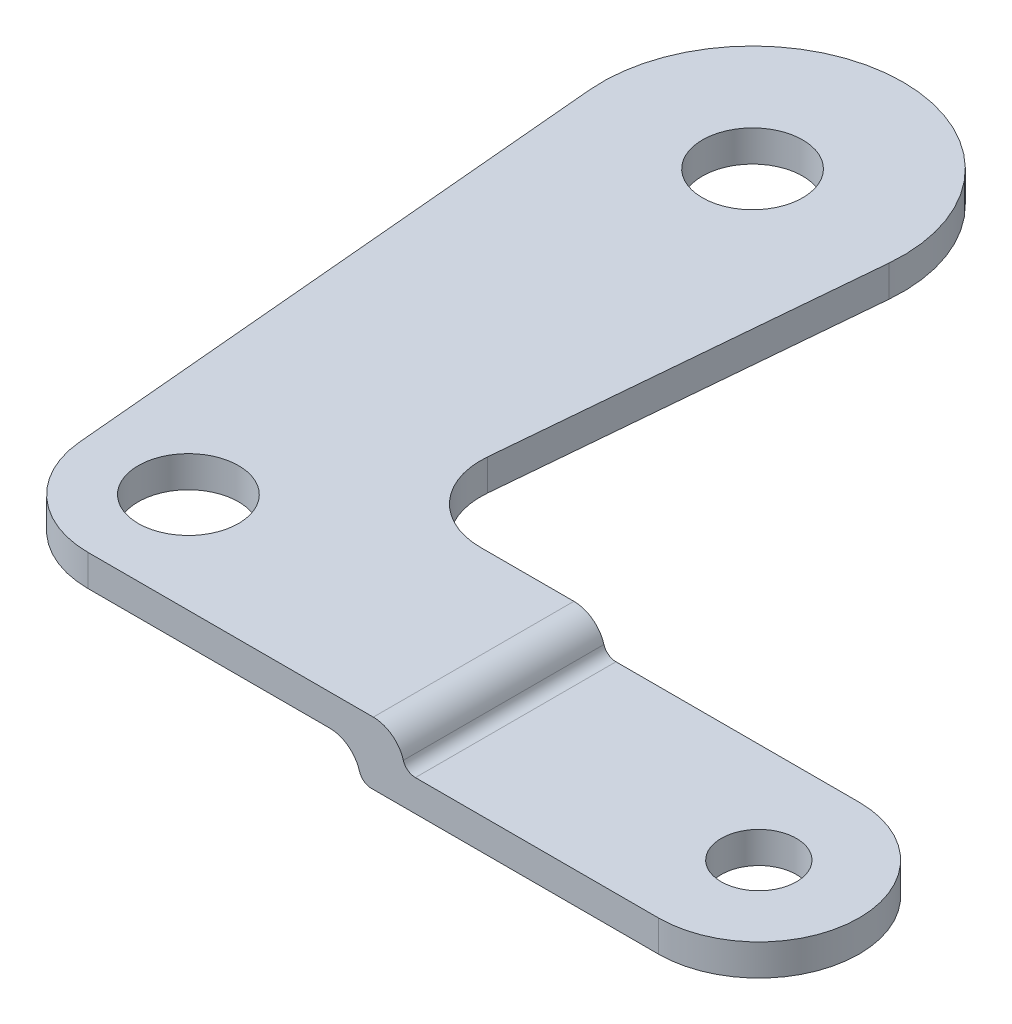
ISO-10303-21;
HEADER;
FILE_DESCRIPTION(('STEP AP214'),'2;1');
FILE_NAME('part.step','',(''),(''),'','','');
FILE_SCHEMA(('AUTOMOTIVE_DESIGN { 1 0 10303 214 1 1 1 1 }'));
ENDSEC;
DATA;
#1=APPLICATION_CONTEXT('core data for automotive mechanical design processes');
#2=APPLICATION_PROTOCOL_DEFINITION('international standard','automotive_design',2000,#1);
#3=PRODUCT_CONTEXT('',#1,'mechanical');
#4=PRODUCT('Part','Part','',(#3));
#5=PRODUCT_RELATED_PRODUCT_CATEGORY('part','',(#4));
#6=PRODUCT_DEFINITION_FORMATION('','',#4);
#7=PRODUCT_DEFINITION_CONTEXT('part definition',#1,'design');
#8=PRODUCT_DEFINITION('design','',#6,#7);
#9=PRODUCT_DEFINITION_SHAPE('','',#8);
#10=(LENGTH_UNIT() NAMED_UNIT(*) SI_UNIT(.MILLI.,.METRE.));
#11=(NAMED_UNIT(*) PLANE_ANGLE_UNIT() SI_UNIT($,.RADIAN.));
#12=(NAMED_UNIT(*) SI_UNIT($,.STERADIAN.) SOLID_ANGLE_UNIT());
#13=UNCERTAINTY_MEASURE_WITH_UNIT(LENGTH_MEASURE(1.E-05),#10,'distance_accuracy_value','');
#14=(GEOMETRIC_REPRESENTATION_CONTEXT(3) GLOBAL_UNCERTAINTY_ASSIGNED_CONTEXT((#13)) GLOBAL_UNIT_ASSIGNED_CONTEXT((#10,
#11,#12)) REPRESENTATION_CONTEXT('',''));
#15=CARTESIAN_POINT('',(0.,0.,0.));
#16=DIRECTION('',(0.,0.,1.));
#17=DIRECTION('',(1.,0.,0.));
#18=AXIS2_PLACEMENT_3D('',#15,#16,#17);
#19=CARTESIAN_POINT('',(0.,2.5,0.));
#20=DIRECTION('',(0.,1.,0.));
#21=DIRECTION('',(0.,0.,1.));
#22=AXIS2_PLACEMENT_3D('',#19,#20,#21);
#23=PLANE('',#22);
#24=CARTESIAN_POINT('',(45.5,2.5,0.));
#25=DIRECTION('',(0.,1.,0.));
#26=DIRECTION('',(0.,0.,1.));
#27=AXIS2_PLACEMENT_3D('',#24,#25,#26);
#28=CIRCLE('',#27,3.);
#29=CARTESIAN_POINT('',(45.5,2.5,2.99999999999999));
#30=VERTEX_POINT('',#29);
#31=EDGE_CURVE('E349',#30,#30,#28,.T.);
#32=ORIENTED_EDGE('',*,*,#31,.F.);
#33=EDGE_LOOP('',(#32));
#34=FACE_BOUND('',#33,.T.);
#35=DIRECTION('',(-1.,0.,0.));
#36=VECTOR('',#35,1.);
#37=CARTESIAN_POINT('',(0.,2.5,-8.));
#38=LINE('',#37,#36);
#39=CARTESIAN_POINT('',(45.5,2.5,-8.00000000000001));
#40=VERTEX_POINT('',#39);
#41=CARTESIAN_POINT('',(26.1041019662497,2.5,-8.00000000000001));
#42=VERTEX_POINT('',#41);
#43=EDGE_CURVE('E122',#40,#42,#38,.T.);
#44=ORIENTED_EDGE('',*,*,#43,.T.);
#45=DIRECTION('',(0.,0.,1.));
#46=VECTOR('',#45,1.);
#47=CARTESIAN_POINT('',(26.1041019662497,2.5,-7.99999999999998));
#48=LINE('',#47,#46);
#49=CARTESIAN_POINT('',(26.1041019662497,2.5,8.00000000000002));
#50=VERTEX_POINT('',#49);
#51=EDGE_CURVE('E117',#42,#50,#48,.T.);
#52=ORIENTED_EDGE('',*,*,#51,.T.);
#53=DIRECTION('',(-1.,0.,0.));
#54=VECTOR('',#53,1.);
#55=CARTESIAN_POINT('',(0.,2.5,8.00000000000002));
#56=LINE('',#55,#54);
#57=CARTESIAN_POINT('',(45.5,2.5,8.00000000000001));
#58=VERTEX_POINT('',#57);
#59=EDGE_CURVE('E346',#58,#50,#56,.T.);
#60=ORIENTED_EDGE('',*,*,#59,.F.);
#61=CARTESIAN_POINT('',(45.5,2.5,0.));
#62=DIRECTION('',(0.,1.,0.));
#63=DIRECTION('',(0.,0.,1.));
#64=AXIS2_PLACEMENT_3D('',#61,#62,#63);
#65=CIRCLE('',#64,8.00000000000001);
#66=EDGE_CURVE('E339',#40,#58,#65,.F.);
#67=ORIENTED_EDGE('',*,*,#66,.F.);
#68=EDGE_LOOP('',(#44,#52,#60,#67));
#69=FACE_BOUND('',#68,.T.);
#70=ADVANCED_FACE('F101',(#34,#69),#23,.T.);
#71=CARTESIAN_POINT('',(45.5,2.5,0.));
#72=DIRECTION('',(0.,-1.,0.));
#73=DIRECTION('',(0.,0.,-1.));
#74=AXIS2_PLACEMENT_3D('',#71,#72,#73);
#75=CYLINDRICAL_SURFACE('',#74,8.00000000000001);
#76=CARTESIAN_POINT('',(45.5,0.,0.));
#77=DIRECTION('',(0.,1.,0.));
#78=DIRECTION('',(0.,0.,1.));
#79=AXIS2_PLACEMENT_3D('',#76,#77,#78);
#80=CIRCLE('',#79,8.00000000000001);
#81=CARTESIAN_POINT('',(45.5,0.,-8.00000000000001));
#82=VERTEX_POINT('',#81);
#83=CARTESIAN_POINT('',(45.5,0.,8.00000000000001));
#84=VERTEX_POINT('',#83);
#85=EDGE_CURVE('E322',#82,#84,#80,.F.);
#86=ORIENTED_EDGE('',*,*,#85,.F.);
#87=DIRECTION('',(0.,-1.,0.));
#88=VECTOR('',#87,1.);
#89=CARTESIAN_POINT('',(45.5,2.5,-8.00000000000001));
#90=LINE('',#89,#88);
#91=EDGE_CURVE('E12',#40,#82,#90,.T.);
#92=ORIENTED_EDGE('',*,*,#91,.F.);
#93=ORIENTED_EDGE('',*,*,#66,.T.);
#94=DIRECTION('',(0.,-1.,0.));
#95=VECTOR('',#94,1.);
#96=CARTESIAN_POINT('',(45.5,2.5,8.00000000000001));
#97=LINE('',#96,#95);
#98=EDGE_CURVE('E110',#58,#84,#97,.T.);
#99=ORIENTED_EDGE('',*,*,#98,.T.);
#100=EDGE_LOOP('',(#86,#92,#93,#99));
#101=FACE_BOUND('',#100,.T.);
#102=ADVANCED_FACE('F103',(#101),#75,.T.);
#103=CARTESIAN_POINT('',(0.,2.5,-8.));
#104=DIRECTION('',(0.,0.,1.));
#105=DIRECTION('',(1.,0.,0.));
#106=AXIS2_PLACEMENT_3D('',#103,#104,#105);
#107=PLANE('',#106);
#108=CARTESIAN_POINT('',(19.25,0.,-7.99999999999998));
#109=DIRECTION('',(0.,0.,1.));
#110=DIRECTION('',(1.,0.,0.));
#111=AXIS2_PLACEMENT_3D('',#108,#109,#110);
#112=CIRCLE('',#111,2.5);
#113=CARTESIAN_POINT('',(19.25,2.5,-8.00000000000001));
#114=VERTEX_POINT('',#113);
#115=CARTESIAN_POINT('',(21.6457871187498,0.714285714285715,-7.99999999999998));
#116=VERTEX_POINT('',#115);
#117=EDGE_CURVE('E214',#114,#116,#112,.F.);
#118=ORIENTED_EDGE('',*,*,#117,.F.);
#119=DIRECTION('',(1.,0.,0.));
#120=VECTOR('',#119,1.);
#121=CARTESIAN_POINT('',(0.,2.5,-8.));
#122=LINE('',#121,#120);
#123=CARTESIAN_POINT('',(15.3050286650834,2.5,-8.));
#124=VERTEX_POINT('',#123);
#125=EDGE_CURVE('E221',#124,#114,#122,.T.);
#126=ORIENTED_EDGE('',*,*,#125,.F.);
#127=DIRECTION('',(0.,-1.,0.));
#128=VECTOR('',#127,1.);
#129=CARTESIAN_POINT('',(15.3050286650834,5.,-8.));
#130=LINE('',#129,#128);
#131=CARTESIAN_POINT('',(15.3050286650834,5.,-8.));
#132=VERTEX_POINT('',#131);
#133=EDGE_CURVE('E218',#132,#124,#130,.T.);
#134=ORIENTED_EDGE('',*,*,#133,.F.);
#135=DIRECTION('',(-1.,0.,0.));
#136=VECTOR('',#135,1.);
#137=CARTESIAN_POINT('',(0.,5.,-7.99999999999998));
#138=LINE('',#137,#136);
#139=CARTESIAN_POINT('',(22.75,5.,-7.99999999999998));
#140=VERTEX_POINT('',#139);
#141=EDGE_CURVE('E203',#140,#132,#138,.T.);
#142=ORIENTED_EDGE('',*,*,#141,.F.);
#143=CARTESIAN_POINT('',(22.75,2.5,-7.99999999999998));
#144=DIRECTION('',(0.,0.,1.));
#145=DIRECTION('',(1.,0.,0.));
#146=AXIS2_PLACEMENT_3D('',#143,#144,#145);
#147=CIRCLE('',#146,2.5);
#148=CARTESIAN_POINT('',(25.1457871187498,3.21428571428572,-7.99999999999998));
#149=VERTEX_POINT('',#148);
#150=EDGE_CURVE('E215',#140,#149,#147,.F.);
#151=ORIENTED_EDGE('',*,*,#150,.T.);
#152=CARTESIAN_POINT('',(26.1041019662497,3.5,-7.99999999999998));
#153=DIRECTION('',(0.,0.,1.));
#154=DIRECTION('',(1.,0.,0.));
#155=AXIS2_PLACEMENT_3D('',#152,#153,#154);
#156=CIRCLE('',#155,1.);
#157=EDGE_CURVE('E290',#149,#42,#156,.T.);
#158=ORIENTED_EDGE('',*,*,#157,.T.);
#159=ORIENTED_EDGE('',*,*,#43,.F.);
#160=ORIENTED_EDGE('',*,*,#91,.T.);
#161=DIRECTION('',(-1.,0.,0.));
#162=VECTOR('',#161,1.);
#163=CARTESIAN_POINT('',(0.,0.,-8.));
#164=LINE('',#163,#162);
#165=CARTESIAN_POINT('',(22.6041019662497,0.,-7.99999999999998));
#166=VERTEX_POINT('',#165);
#167=EDGE_CURVE('E356',#82,#166,#164,.T.);
#168=ORIENTED_EDGE('',*,*,#167,.T.);
#169=CARTESIAN_POINT('',(22.6041019662497,1.,-7.99999999999998));
#170=DIRECTION('',(0.,0.,1.));
#171=DIRECTION('',(1.,0.,0.));
#172=AXIS2_PLACEMENT_3D('',#169,#170,#171);
#173=CIRCLE('',#172,1.);
#174=EDGE_CURVE('E299',#116,#166,#173,.T.);
#175=ORIENTED_EDGE('',*,*,#174,.F.);
#176=EDGE_LOOP('',(#118,#126,#134,#142,#151,#158,#159,#160,#168,#175));
#177=FACE_BOUND('',#176,.T.);
#178=ADVANCED_FACE('F220',(#177),#107,.F.);
#179=CARTESIAN_POINT('',(0.,2.5,8.00000000000002));
#180=DIRECTION('',(0.,0.,1.));
#181=DIRECTION('',(1.,0.,0.));
#182=AXIS2_PLACEMENT_3D('',#179,#180,#181);
#183=PLANE('',#182);
#184=DIRECTION('',(1.,0.,0.));
#185=VECTOR('',#184,1.);
#186=CARTESIAN_POINT('',(0.,2.5,8.00000000000002));
#187=LINE('',#186,#185);
#188=CARTESIAN_POINT('',(0.,2.5,8.00000000000001));
#189=VERTEX_POINT('',#188);
#190=CARTESIAN_POINT('',(19.25,2.5,8.00000000000002));
#191=VERTEX_POINT('',#190);
#192=EDGE_CURVE('E233',#189,#191,#187,.T.);
#193=ORIENTED_EDGE('',*,*,#192,.T.);
#194=CARTESIAN_POINT('',(19.25,0.,8.00000000000002));
#195=DIRECTION('',(0.,0.,1.));
#196=DIRECTION('',(1.,0.,0.));
#197=AXIS2_PLACEMENT_3D('',#194,#195,#196);
#198=CIRCLE('',#197,2.5);
#199=CARTESIAN_POINT('',(21.6457871187498,0.714285714285715,8.00000000000002));
#200=VERTEX_POINT('',#199);
#201=EDGE_CURVE('E313',#191,#200,#198,.F.);
#202=ORIENTED_EDGE('',*,*,#201,.T.);
#203=CARTESIAN_POINT('',(22.6041019662497,1.,8.00000000000002));
#204=DIRECTION('',(0.,0.,1.));
#205=DIRECTION('',(1.,0.,0.));
#206=AXIS2_PLACEMENT_3D('',#203,#204,#205);
#207=CIRCLE('',#206,1.);
#208=CARTESIAN_POINT('',(22.6041019662497,0.,8.00000000000002));
#209=VERTEX_POINT('',#208);
#210=EDGE_CURVE('E293',#200,#209,#207,.T.);
#211=ORIENTED_EDGE('',*,*,#210,.T.);
#212=DIRECTION('',(-1.,0.,0.));
#213=VECTOR('',#212,1.);
#214=CARTESIAN_POINT('',(0.,0.,8.00000000000002));
#215=LINE('',#214,#213);
#216=EDGE_CURVE('E359',#84,#209,#215,.T.);
#217=ORIENTED_EDGE('',*,*,#216,.F.);
#218=ORIENTED_EDGE('',*,*,#98,.F.);
#219=ORIENTED_EDGE('',*,*,#59,.T.);
#220=CARTESIAN_POINT('',(26.1041019662497,3.5,8.00000000000002));
#221=DIRECTION('',(0.,0.,1.));
#222=DIRECTION('',(1.,0.,0.));
#223=AXIS2_PLACEMENT_3D('',#220,#221,#222);
#224=CIRCLE('',#223,1.);
#225=CARTESIAN_POINT('',(25.1457871187498,3.21428571428572,8.00000000000002));
#226=VERTEX_POINT('',#225);
#227=EDGE_CURVE('E226',#226,#50,#224,.T.);
#228=ORIENTED_EDGE('',*,*,#227,.F.);
#229=CARTESIAN_POINT('',(22.75,2.5,8.00000000000002));
#230=DIRECTION('',(0.,0.,1.));
#231=DIRECTION('',(1.,0.,0.));
#232=AXIS2_PLACEMENT_3D('',#229,#230,#231);
#233=CIRCLE('',#232,2.5);
#234=CARTESIAN_POINT('',(22.75,5.,8.00000000000002));
#235=VERTEX_POINT('',#234);
#236=EDGE_CURVE('E307',#235,#226,#233,.F.);
#237=ORIENTED_EDGE('',*,*,#236,.F.);
#238=DIRECTION('',(-1.,0.,0.));
#239=VECTOR('',#238,1.);
#240=CARTESIAN_POINT('',(0.,5.,8.00000000000002));
#241=LINE('',#240,#239);
#242=CARTESIAN_POINT('',(0.,5.,8.00000000000001));
#243=VERTEX_POINT('',#242);
#244=EDGE_CURVE('E310',#235,#243,#241,.T.);
#245=ORIENTED_EDGE('',*,*,#244,.T.);
#246=DIRECTION('',(0.,-1.,0.));
#247=VECTOR('',#246,1.);
#248=CARTESIAN_POINT('',(0.,5.,8.00000000000001));
#249=LINE('',#248,#247);
#250=EDGE_CURVE('E255',#243,#189,#249,.T.);
#251=ORIENTED_EDGE('',*,*,#250,.T.);
#252=EDGE_LOOP('',(#193,#202,#211,#217,#218,#219,#228,#237,#245,#251));
#253=FACE_BOUND('',#252,.T.);
#254=ADVANCED_FACE('F374',(#253),#183,.T.);
#255=CARTESIAN_POINT('',(45.5,2.5,0.));
#256=DIRECTION('',(0.,-1.,0.));
#257=DIRECTION('',(0.,0.,-1.));
#258=AXIS2_PLACEMENT_3D('',#255,#256,#257);
#259=CYLINDRICAL_SURFACE('',#258,3.);
#260=ORIENTED_EDGE('',*,*,#31,.T.);
#261=EDGE_LOOP('',(#260));
#262=FACE_BOUND('',#261,.T.);
#263=CARTESIAN_POINT('',(45.5,0.,0.));
#264=DIRECTION('',(0.,1.,0.));
#265=DIRECTION('',(0.,0.,1.));
#266=AXIS2_PLACEMENT_3D('',#263,#264,#265);
#267=CIRCLE('',#266,3.);
#268=CARTESIAN_POINT('',(45.5,0.,2.99999999999999));
#269=VERTEX_POINT('',#268);
#270=EDGE_CURVE('E343',#269,#269,#267,.T.);
#271=ORIENTED_EDGE('',*,*,#270,.F.);
#272=EDGE_LOOP('',(#271));
#273=FACE_BOUND('',#272,.T.);
#274=ADVANCED_FACE('F427',(#262,#273),#259,.F.);
#275=CARTESIAN_POINT('',(0.,0.,0.));
#276=DIRECTION('',(0.,1.,0.));
#277=DIRECTION('',(0.,0.,1.));
#278=AXIS2_PLACEMENT_3D('',#275,#276,#277);
#279=PLANE('',#278);
#280=ORIENTED_EDGE('',*,*,#85,.T.);
#281=ORIENTED_EDGE('',*,*,#216,.T.);
#282=DIRECTION('',(0.,0.,1.));
#283=VECTOR('',#282,1.);
#284=CARTESIAN_POINT('',(22.6041019662497,0.,-7.99999999999998));
#285=LINE('',#284,#283);
#286=EDGE_CURVE('E323',#166,#209,#285,.T.);
#287=ORIENTED_EDGE('',*,*,#286,.F.);
#288=ORIENTED_EDGE('',*,*,#167,.F.);
#289=EDGE_LOOP('',(#280,#281,#287,#288));
#290=FACE_BOUND('',#289,.T.);
#291=ORIENTED_EDGE('',*,*,#270,.T.);
#292=EDGE_LOOP('',(#291));
#293=FACE_BOUND('',#292,.T.);
#294=ADVANCED_FACE('F371',(#290,#293),#279,.F.);
#295=CARTESIAN_POINT('',(26.1041019662497,3.5,-7.99999999999998));
#296=DIRECTION('',(0.,0.,1.));
#297=DIRECTION('',(1.,0.,0.));
#298=AXIS2_PLACEMENT_3D('',#295,#296,#297);
#299=CYLINDRICAL_SURFACE('',#298,1.);
#300=ORIENTED_EDGE('',*,*,#227,.T.);
#301=ORIENTED_EDGE('',*,*,#51,.F.);
#302=ORIENTED_EDGE('',*,*,#157,.F.);
#303=DIRECTION('',(0.,0.,1.));
#304=VECTOR('',#303,1.);
#305=CARTESIAN_POINT('',(25.1457871187498,3.21428571428572,-7.99999999999998));
#306=LINE('',#305,#304);
#307=EDGE_CURVE('E303',#149,#226,#306,.T.);
#308=ORIENTED_EDGE('',*,*,#307,.T.);
#309=EDGE_LOOP('',(#300,#301,#302,#308));
#310=FACE_BOUND('',#309,.T.);
#311=ADVANCED_FACE('F412',(#310),#299,.F.);
#312=CARTESIAN_POINT('',(22.6041019662497,1.,-7.99999999999998));
#313=DIRECTION('',(0.,0.,1.));
#314=DIRECTION('',(1.,0.,0.));
#315=AXIS2_PLACEMENT_3D('',#312,#313,#314);
#316=CYLINDRICAL_SURFACE('',#315,1.);
#317=ORIENTED_EDGE('',*,*,#210,.F.);
#318=DIRECTION('',(0.,0.,1.));
#319=VECTOR('',#318,1.);
#320=CARTESIAN_POINT('',(21.6457871187498,0.714285714285715,-7.99999999999998));
#321=LINE('',#320,#319);
#322=EDGE_CURVE('E327',#116,#200,#321,.T.);
#323=ORIENTED_EDGE('',*,*,#322,.F.);
#324=ORIENTED_EDGE('',*,*,#174,.T.);
#325=ORIENTED_EDGE('',*,*,#286,.T.);
#326=EDGE_LOOP('',(#317,#323,#324,#325));
#327=FACE_BOUND('',#326,.T.);
#328=ADVANCED_FACE('F378',(#327),#316,.T.);
#329=CARTESIAN_POINT('',(19.25,0.,-7.99999999999998));
#330=DIRECTION('',(0.,0.,1.));
#331=DIRECTION('',(1.,0.,0.));
#332=AXIS2_PLACEMENT_3D('',#329,#330,#331);
#333=CYLINDRICAL_SURFACE('',#332,2.5);
#334=ORIENTED_EDGE('',*,*,#201,.F.);
#335=DIRECTION('',(0.,0.,1.));
#336=VECTOR('',#335,1.);
#337=CARTESIAN_POINT('',(19.25,2.5,-7.99999999999998));
#338=LINE('',#337,#336);
#339=EDGE_CURVE('E330',#114,#191,#338,.T.);
#340=ORIENTED_EDGE('',*,*,#339,.F.);
#341=ORIENTED_EDGE('',*,*,#117,.T.);
#342=ORIENTED_EDGE('',*,*,#322,.T.);
#343=EDGE_LOOP('',(#334,#340,#341,#342));
#344=FACE_BOUND('',#343,.T.);
#345=ADVANCED_FACE('F382',(#344),#333,.F.);
#346=CARTESIAN_POINT('',(0.,5.,-7.99999999999998));
#347=DIRECTION('',(0.,1.,0.));
#348=DIRECTION('',(0.,0.,1.));
#349=AXIS2_PLACEMENT_3D('',#346,#347,#348);
#350=PLANE('',#349);
#351=ORIENTED_EDGE('',*,*,#244,.F.);
#352=DIRECTION('',(0.,0.,1.));
#353=VECTOR('',#352,1.);
#354=CARTESIAN_POINT('',(22.75,5.,-7.99999999999998));
#355=LINE('',#354,#353);
#356=EDGE_CURVE('E210',#140,#235,#355,.T.);
#357=ORIENTED_EDGE('',*,*,#356,.F.);
#358=ORIENTED_EDGE('',*,*,#141,.T.);
#359=CARTESIAN_POINT('',(15.3050286650834,5.,-14.));
#360=DIRECTION('',(0.,1.,0.));
#361=DIRECTION('',(0.,0.,1.));
#362=AXIS2_PLACEMENT_3D('',#359,#360,#361);
#363=CIRCLE('',#362,6.);
#364=CARTESIAN_POINT('',(9.32877937681275,5.,-14.5333333333333));
#365=VERTEX_POINT('',#364);
#366=EDGE_CURVE('E209',#365,#132,#363,.T.);
#367=ORIENTED_EDGE('',*,*,#366,.F.);
#368=DIRECTION('',(0.0888888888888885,0.,-0.99604154804511));
#369=VECTOR('',#368,1.);
#370=CARTESIAN_POINT('',(7.9683323843609,5.,0.71111111111111));
#371=LINE('',#370,#369);
#372=CARTESIAN_POINT('',(11.9524985765413,5.,-43.9333333333334));
#373=VERTEX_POINT('',#372);
#374=EDGE_CURVE('E232',#365,#373,#371,.T.);
#375=ORIENTED_EDGE('',*,*,#374,.T.);
#376=CARTESIAN_POINT('',(0.,5.,-45.));
#377=DIRECTION('',(0.,1.,0.));
#378=DIRECTION('',(0.,0.,1.));
#379=AXIS2_PLACEMENT_3D('',#376,#377,#378);
#380=CIRCLE('',#379,12.);
#381=CARTESIAN_POINT('',(-11.9524985765413,5.,-43.9333333333334));
#382=VERTEX_POINT('',#381);
#383=EDGE_CURVE('E237',#373,#382,#380,.T.);
#384=ORIENTED_EDGE('',*,*,#383,.T.);
#385=DIRECTION('',(-0.0888888888888889,0.,-0.99604154804511));
#386=VECTOR('',#385,1.);
#387=CARTESIAN_POINT('',(-7.96833238436088,5.,0.711111111111111));
#388=LINE('',#387,#386);
#389=CARTESIAN_POINT('',(-7.96833238436088,5.,0.71111111111111));
#390=VERTEX_POINT('',#389);
#391=EDGE_CURVE('E247',#390,#382,#388,.T.);
#392=ORIENTED_EDGE('',*,*,#391,.F.);
#393=CARTESIAN_POINT('',(0.,5.,0.));
#394=DIRECTION('',(0.,1.,0.));
#395=DIRECTION('',(0.,0.,1.));
#396=AXIS2_PLACEMENT_3D('',#393,#394,#395);
#397=CIRCLE('',#396,8.00000000000001);
#398=EDGE_CURVE('E251',#390,#243,#397,.T.);
#399=ORIENTED_EDGE('',*,*,#398,.T.);
#400=EDGE_LOOP('',(#351,#357,#358,#367,#375,#384,#392,#399));
#401=FACE_BOUND('',#400,.T.);
#402=CARTESIAN_POINT('',(0.,5.,0.));
#403=DIRECTION('',(0.,1.,0.));
#404=DIRECTION('',(0.,0.,1.));
#405=AXIS2_PLACEMENT_3D('',#402,#403,#404);
#406=CIRCLE('',#405,4.);
#407=CARTESIAN_POINT('',(0.,5.,4.));
#408=VERTEX_POINT('',#407);
#409=EDGE_CURVE('E259',#408,#408,#406,.T.);
#410=ORIENTED_EDGE('',*,*,#409,.F.);
#411=EDGE_LOOP('',(#410));
#412=FACE_BOUND('',#411,.T.);
#413=CARTESIAN_POINT('',(0.,5.,-45.));
#414=DIRECTION('',(0.,1.,0.));
#415=DIRECTION('',(0.,0.,1.));
#416=AXIS2_PLACEMENT_3D('',#413,#414,#415);
#417=CIRCLE('',#416,4.);
#418=CARTESIAN_POINT('',(0.,5.,-41.));
#419=VERTEX_POINT('',#418);
#420=EDGE_CURVE('E592',#419,#419,#417,.T.);
#421=ORIENTED_EDGE('',*,*,#420,.F.);
#422=EDGE_LOOP('',(#421));
#423=FACE_BOUND('',#422,.T.);
#424=ADVANCED_FACE('F206',(#401,#412,#423),#350,.T.);
#425=CARTESIAN_POINT('',(22.75,2.5,-7.99999999999998));
#426=DIRECTION('',(0.,0.,1.));
#427=DIRECTION('',(1.,0.,0.));
#428=AXIS2_PLACEMENT_3D('',#425,#426,#427);
#429=CYLINDRICAL_SURFACE('',#428,2.5);
#430=ORIENTED_EDGE('',*,*,#236,.T.);
#431=ORIENTED_EDGE('',*,*,#307,.F.);
#432=ORIENTED_EDGE('',*,*,#150,.F.);
#433=ORIENTED_EDGE('',*,*,#356,.T.);
#434=EDGE_LOOP('',(#430,#431,#432,#433));
#435=FACE_BOUND('',#434,.T.);
#436=ADVANCED_FACE('F409',(#435),#429,.T.);
#437=CARTESIAN_POINT('',(15.3050286650834,2.5,-14.));
#438=DIRECTION('',(0.,1.,0.));
#439=DIRECTION('',(0.,0.,1.));
#440=AXIS2_PLACEMENT_3D('',#437,#438,#439);
#441=PLANE('',#440);
#442=ORIENTED_EDGE('',*,*,#339,.T.);
#443=ORIENTED_EDGE('',*,*,#192,.F.);
#444=CARTESIAN_POINT('',(0.,2.5,0.));
#445=DIRECTION('',(0.,1.,0.));
#446=DIRECTION('',(0.,0.,1.));
#447=AXIS2_PLACEMENT_3D('',#444,#445,#446);
#448=CIRCLE('',#447,8.00000000000001);
#449=CARTESIAN_POINT('',(-7.96833238436088,2.5,0.71111111111111));
#450=VERTEX_POINT('',#449);
#451=EDGE_CURVE('E239',#450,#189,#448,.T.);
#452=ORIENTED_EDGE('',*,*,#451,.F.);
#453=DIRECTION('',(-0.0888888888888889,0.,-0.99604154804511));
#454=VECTOR('',#453,1.);
#455=CARTESIAN_POINT('',(-7.96833238436088,2.5,0.711111111111111));
#456=LINE('',#455,#454);
#457=CARTESIAN_POINT('',(-11.9524985765413,2.5,-43.9333333333334));
#458=VERTEX_POINT('',#457);
#459=EDGE_CURVE('E269',#450,#458,#456,.T.);
#460=ORIENTED_EDGE('',*,*,#459,.T.);
#461=CARTESIAN_POINT('',(0.,2.5,-45.));
#462=DIRECTION('',(0.,1.,0.));
#463=DIRECTION('',(0.,0.,1.));
#464=AXIS2_PLACEMENT_3D('',#461,#462,#463);
#465=CIRCLE('',#464,12.);
#466=CARTESIAN_POINT('',(11.9524985765413,2.5,-43.9333333333334));
#467=VERTEX_POINT('',#466);
#468=EDGE_CURVE('E265',#467,#458,#465,.T.);
#469=ORIENTED_EDGE('',*,*,#468,.F.);
#470=DIRECTION('',(0.0888888888888885,0.,-0.99604154804511));
#471=VECTOR('',#470,1.);
#472=CARTESIAN_POINT('',(7.9683323843609,2.5,0.71111111111111));
#473=LINE('',#472,#471);
#474=CARTESIAN_POINT('',(9.32877937681275,2.5,-14.5333333333333));
#475=VERTEX_POINT('',#474);
#476=EDGE_CURVE('E262',#475,#467,#473,.T.);
#477=ORIENTED_EDGE('',*,*,#476,.F.);
#478=CARTESIAN_POINT('',(15.3050286650834,2.5,-14.));
#479=DIRECTION('',(0.,1.,0.));
#480=DIRECTION('',(0.,0.,1.));
#481=AXIS2_PLACEMENT_3D('',#478,#479,#480);
#482=CIRCLE('',#481,6.);
#483=EDGE_CURVE('E258',#475,#124,#482,.T.);
#484=ORIENTED_EDGE('',*,*,#483,.T.);
#485=ORIENTED_EDGE('',*,*,#125,.T.);
#486=EDGE_LOOP('',(#442,#443,#452,#460,#469,#477,#484,#485));
#487=FACE_BOUND('',#486,.T.);
#488=CARTESIAN_POINT('',(0.,2.5,0.));
#489=DIRECTION('',(0.,1.,0.));
#490=DIRECTION('',(0.,0.,1.));
#491=AXIS2_PLACEMENT_3D('',#488,#489,#490);
#492=CIRCLE('',#491,4.);
#493=CARTESIAN_POINT('',(0.,2.5,4.));
#494=VERTEX_POINT('',#493);
#495=EDGE_CURVE('E242',#494,#494,#492,.T.);
#496=ORIENTED_EDGE('',*,*,#495,.T.);
#497=EDGE_LOOP('',(#496));
#498=FACE_BOUND('',#497,.T.);
#499=CARTESIAN_POINT('',(0.,2.5,-45.));
#500=DIRECTION('',(0.,1.,0.));
#501=DIRECTION('',(0.,0.,1.));
#502=AXIS2_PLACEMENT_3D('',#499,#500,#501);
#503=CIRCLE('',#502,4.);
#504=CARTESIAN_POINT('',(0.,2.5,-41.));
#505=VERTEX_POINT('',#504);
#506=EDGE_CURVE('E595',#505,#505,#503,.T.);
#507=ORIENTED_EDGE('',*,*,#506,.T.);
#508=EDGE_LOOP('',(#507));
#509=FACE_BOUND('',#508,.T.);
#510=ADVANCED_FACE('F385',(#487,#498,#509),#441,.F.);
#511=CARTESIAN_POINT('',(15.3050286650834,5.,-14.));
#512=DIRECTION('',(0.,-1.,0.));
#513=DIRECTION('',(0.,0.,-1.));
#514=AXIS2_PLACEMENT_3D('',#511,#512,#513);
#515=CYLINDRICAL_SURFACE('',#514,6.);
#516=ORIENTED_EDGE('',*,*,#483,.F.);
#517=DIRECTION('',(0.,-1.,0.));
#518=VECTOR('',#517,1.);
#519=CARTESIAN_POINT('',(9.32877937681275,5.,-14.5333333333333));
#520=LINE('',#519,#518);
#521=EDGE_CURVE('E227',#365,#475,#520,.T.);
#522=ORIENTED_EDGE('',*,*,#521,.F.);
#523=ORIENTED_EDGE('',*,*,#366,.T.);
#524=ORIENTED_EDGE('',*,*,#133,.T.);
#525=EDGE_LOOP('',(#516,#522,#523,#524));
#526=FACE_BOUND('',#525,.T.);
#527=ADVANCED_FACE('F229',(#526),#515,.F.);
#528=CARTESIAN_POINT('',(7.9683323843609,5.,0.71111111111111));
#529=DIRECTION('',(-0.99604154804511,0.,-0.0888888888888885));
#530=DIRECTION('',(-0.0888888888888885,0.,0.99604154804511));
#531=AXIS2_PLACEMENT_3D('',#528,#529,#530);
#532=PLANE('',#531);
#533=ORIENTED_EDGE('',*,*,#476,.T.);
#534=DIRECTION('',(0.,-1.,0.));
#535=VECTOR('',#534,1.);
#536=CARTESIAN_POINT('',(11.9524985765413,5.,-43.9333333333334));
#537=LINE('',#536,#535);
#538=EDGE_CURVE('E284',#373,#467,#537,.T.);
#539=ORIENTED_EDGE('',*,*,#538,.F.);
#540=ORIENTED_EDGE('',*,*,#374,.F.);
#541=ORIENTED_EDGE('',*,*,#521,.T.);
#542=EDGE_LOOP('',(#533,#539,#540,#541));
#543=FACE_BOUND('',#542,.T.);
#544=ADVANCED_FACE('F392',(#543),#532,.F.);
#545=CARTESIAN_POINT('',(0.,5.,-45.));
#546=DIRECTION('',(0.,-1.,0.));
#547=DIRECTION('',(0.,0.,-1.));
#548=AXIS2_PLACEMENT_3D('',#545,#546,#547);
#549=CYLINDRICAL_SURFACE('',#548,12.);
#550=ORIENTED_EDGE('',*,*,#468,.T.);
#551=DIRECTION('',(0.,-1.,0.));
#552=VECTOR('',#551,1.);
#553=CARTESIAN_POINT('',(-11.9524985765413,5.,-43.9333333333334));
#554=LINE('',#553,#552);
#555=EDGE_CURVE('E281',#382,#458,#554,.T.);
#556=ORIENTED_EDGE('',*,*,#555,.F.);
#557=ORIENTED_EDGE('',*,*,#383,.F.);
#558=ORIENTED_EDGE('',*,*,#538,.T.);
#559=EDGE_LOOP('',(#550,#556,#557,#558));
#560=FACE_BOUND('',#559,.T.);
#561=ADVANCED_FACE('F395',(#560),#549,.T.);
#562=CARTESIAN_POINT('',(-7.96833238436088,5.,0.711111111111111));
#563=DIRECTION('',(-0.99604154804511,0.,0.0888888888888889));
#564=DIRECTION('',(0.0888888888888889,0.,0.99604154804511));
#565=AXIS2_PLACEMENT_3D('',#562,#563,#564);
#566=PLANE('',#565);
#567=ORIENTED_EDGE('',*,*,#459,.F.);
#568=DIRECTION('',(0.,-1.,0.));
#569=VECTOR('',#568,1.);
#570=CARTESIAN_POINT('',(-7.96833238436088,5.,0.71111111111111));
#571=LINE('',#570,#569);
#572=EDGE_CURVE('E278',#390,#450,#571,.T.);
#573=ORIENTED_EDGE('',*,*,#572,.F.);
#574=ORIENTED_EDGE('',*,*,#391,.T.);
#575=ORIENTED_EDGE('',*,*,#555,.T.);
#576=EDGE_LOOP('',(#567,#573,#574,#575));
#577=FACE_BOUND('',#576,.T.);
#578=ADVANCED_FACE('F402',(#577),#566,.T.);
#579=CARTESIAN_POINT('',(0.,5.,0.));
#580=DIRECTION('',(0.,-1.,0.));
#581=DIRECTION('',(0.,0.,-1.));
#582=AXIS2_PLACEMENT_3D('',#579,#580,#581);
#583=CYLINDRICAL_SURFACE('',#582,8.00000000000001);
#584=ORIENTED_EDGE('',*,*,#451,.T.);
#585=ORIENTED_EDGE('',*,*,#250,.F.);
#586=ORIENTED_EDGE('',*,*,#398,.F.);
#587=ORIENTED_EDGE('',*,*,#572,.T.);
#588=EDGE_LOOP('',(#584,#585,#586,#587));
#589=FACE_BOUND('',#588,.T.);
#590=ADVANCED_FACE('F404',(#589),#583,.T.);
#591=CARTESIAN_POINT('',(0.,5.,0.));
#592=DIRECTION('',(0.,-1.,0.));
#593=DIRECTION('',(0.,0.,-1.));
#594=AXIS2_PLACEMENT_3D('',#591,#592,#593);
#595=CYLINDRICAL_SURFACE('',#594,4.);
#596=ORIENTED_EDGE('',*,*,#409,.T.);
#597=EDGE_LOOP('',(#596));
#598=FACE_BOUND('',#597,.T.);
#599=ORIENTED_EDGE('',*,*,#495,.F.);
#600=EDGE_LOOP('',(#599));
#601=FACE_BOUND('',#600,.T.);
#602=ADVANCED_FACE('F513',(#598,#601),#595,.F.);
#603=CARTESIAN_POINT('',(0.,5.,-45.));
#604=DIRECTION('',(0.,-1.,0.));
#605=DIRECTION('',(0.,0.,-1.));
#606=AXIS2_PLACEMENT_3D('',#603,#604,#605);
#607=CYLINDRICAL_SURFACE('',#606,4.);
#608=ORIENTED_EDGE('',*,*,#420,.T.);
#609=EDGE_LOOP('',(#608));
#610=FACE_BOUND('',#609,.T.);
#611=ORIENTED_EDGE('',*,*,#506,.F.);
#612=EDGE_LOOP('',(#611));
#613=FACE_BOUND('',#612,.T.);
#614=ADVANCED_FACE('F520',(#610,#613),#607,.F.);
#615=CLOSED_SHELL('',(#70,#102,#178,#254,#274,#294,#311,#328,#345,#424,#436,#510,#527,#544,#561,
#578,#590,#602,#614));
#616=MANIFOLD_SOLID_BREP('B2',#615);
#617=ADVANCED_BREP_SHAPE_REPRESENTATION('',(#18,#616),#14);
#618=SHAPE_DEFINITION_REPRESENTATION(#9,#617);
ENDSEC;
END-ISO-10303-21;
